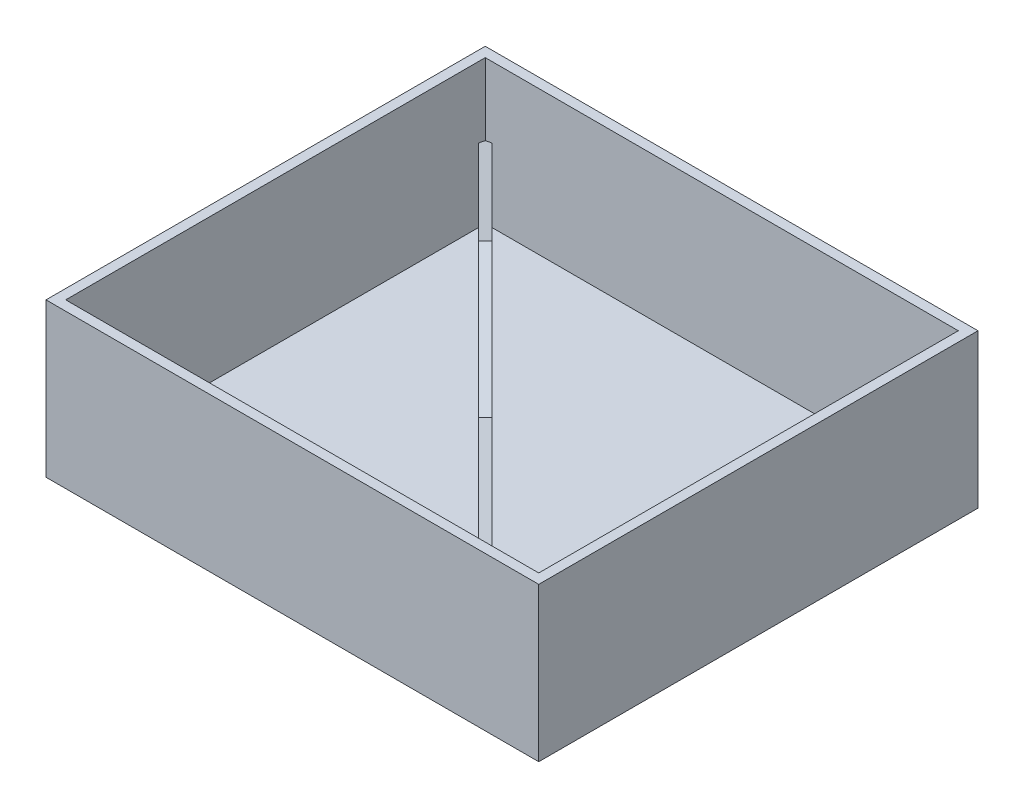
ISO-10303-21;
HEADER;
FILE_DESCRIPTION(('STEP AP214'),'2;1');
FILE_NAME('part.step','',(''),(''),'','','');
FILE_SCHEMA(('AUTOMOTIVE_DESIGN { 1 0 10303 214 1 1 1 1 }'));
ENDSEC;
DATA;
#1=APPLICATION_CONTEXT('core data for automotive mechanical design processes');
#2=APPLICATION_PROTOCOL_DEFINITION('international standard','automotive_design',2000,#1);
#3=PRODUCT_CONTEXT('',#1,'mechanical');
#4=PRODUCT('Part','Part','',(#3));
#5=PRODUCT_RELATED_PRODUCT_CATEGORY('part','',(#4));
#6=PRODUCT_DEFINITION_FORMATION('','',#4);
#7=PRODUCT_DEFINITION_CONTEXT('part definition',#1,'design');
#8=PRODUCT_DEFINITION('design','',#6,#7);
#9=PRODUCT_DEFINITION_SHAPE('','',#8);
#10=(LENGTH_UNIT() NAMED_UNIT(*) SI_UNIT(.MILLI.,.METRE.));
#11=(NAMED_UNIT(*) PLANE_ANGLE_UNIT() SI_UNIT($,.RADIAN.));
#12=(NAMED_UNIT(*) SI_UNIT($,.STERADIAN.) SOLID_ANGLE_UNIT());
#13=UNCERTAINTY_MEASURE_WITH_UNIT(LENGTH_MEASURE(1.E-05),#10,'distance_accuracy_value','');
#14=(GEOMETRIC_REPRESENTATION_CONTEXT(3) GLOBAL_UNCERTAINTY_ASSIGNED_CONTEXT((#13)) GLOBAL_UNIT_ASSIGNED_CONTEXT((#10,
#11,#12)) REPRESENTATION_CONTEXT('',''));
#15=CARTESIAN_POINT('',(0.,0.,0.));
#16=DIRECTION('',(0.,0.,1.));
#17=DIRECTION('',(1.,0.,0.));
#18=AXIS2_PLACEMENT_3D('',#15,#16,#17);
#19=CARTESIAN_POINT('',(0.,2.54,0.));
#20=DIRECTION('',(0.,1.,0.));
#21=DIRECTION('',(0.,0.,1.));
#22=AXIS2_PLACEMENT_3D('',#19,#20,#21);
#23=PLANE('',#22);
#24=DIRECTION('',(-1.,0.,0.));
#25=VECTOR('',#24,1.);
#26=CARTESIAN_POINT('',(-62.4778997860176,2.54,-61.397043942379));
#27=LINE('',#26,#25);
#28=CARTESIAN_POINT('',(62.0602912861796,2.54,-61.397043942379));
#29=VERTEX_POINT('',#28);
#30=CARTESIAN_POINT('',(-58.1418485618038,2.54,-61.397043942379));
#31=VERTEX_POINT('',#30);
#32=EDGE_CURVE('E207',#29,#31,#27,.T.);
#33=ORIENTED_EDGE('',*,*,#32,.T.);
#34=DIRECTION('',(0.707106781186548,0.,0.707106781186547));
#35=VECTOR('',#34,1.);
#36=CARTESIAN_POINT('',(1.62759769028759,2.54,-1.62759769028759));
#37=LINE('',#36,#35);
#38=CARTESIAN_POINT('',(50.0607977593407,2.54,46.8056023787655));
#39=VERTEX_POINT('',#38);
#40=EDGE_CURVE('E244',#31,#39,#37,.T.);
#41=ORIENTED_EDGE('',*,*,#40,.T.);
#42=DIRECTION('',(1.,0.,0.));
#43=VECTOR('',#42,1.);
#44=CARTESIAN_POINT('',(-62.4778997860176,2.54,46.8056023787655));
#45=LINE('',#44,#43);
#46=CARTESIAN_POINT('',(62.0602912861796,2.54,46.8056023787655));
#47=VERTEX_POINT('',#46);
#48=EDGE_CURVE('E186',#39,#47,#45,.T.);
#49=ORIENTED_EDGE('',*,*,#48,.T.);
#50=DIRECTION('',(0.,0.,-1.));
#51=VECTOR('',#50,1.);
#52=CARTESIAN_POINT('',(62.0602912861796,2.54,-63.9370439423789));
#53=LINE('',#52,#51);
#54=EDGE_CURVE('E204',#47,#29,#53,.T.);
#55=ORIENTED_EDGE('',*,*,#54,.T.);
#56=EDGE_LOOP('',(#33,#41,#49,#55));
#57=FACE_BOUND('',#56,.T.);
#58=ADVANCED_FACE('F43',(#57),#23,.T.);
#59=CARTESIAN_POINT('',(-62.4778997860176,39.624,-63.9370439423789));
#60=DIRECTION('',(1.,0.,0.));
#61=DIRECTION('',(0.,0.,-1.));
#62=AXIS2_PLACEMENT_3D('',#59,#60,#61);
#63=PLANE('',#62);
#64=DIRECTION('',(0.,-1.,0.));
#65=VECTOR('',#64,1.);
#66=CARTESIAN_POINT('',(-62.4778997860176,39.624,-63.9370439423789));
#67=LINE('',#66,#65);
#68=CARTESIAN_POINT('',(-62.4778997860176,39.624,-63.9370439423789));
#69=VERTEX_POINT('',#68);
#70=CARTESIAN_POINT('',(-62.4778997860176,0.,-63.9370439423789));
#71=VERTEX_POINT('',#70);
#72=EDGE_CURVE('E227',#69,#71,#67,.T.);
#73=ORIENTED_EDGE('',*,*,#72,.T.);
#74=DIRECTION('',(0.,0.,1.));
#75=VECTOR('',#74,1.);
#76=CARTESIAN_POINT('',(-62.4778997860176,0.,-63.9370439423789));
#77=LINE('',#76,#75);
#78=CARTESIAN_POINT('',(-62.4778997860176,0.,49.3456023787655));
#79=VERTEX_POINT('',#78);
#80=EDGE_CURVE('E194',#71,#79,#77,.T.);
#81=ORIENTED_EDGE('',*,*,#80,.T.);
#82=DIRECTION('',(0.,-1.,0.));
#83=VECTOR('',#82,1.);
#84=CARTESIAN_POINT('',(-62.4778997860176,39.624,49.3456023787655));
#85=LINE('',#84,#83);
#86=CARTESIAN_POINT('',(-62.4778997860176,39.624,49.3456023787655));
#87=VERTEX_POINT('',#86);
#88=EDGE_CURVE('E245',#87,#79,#85,.T.);
#89=ORIENTED_EDGE('',*,*,#88,.F.);
#90=DIRECTION('',(0.,0.,1.));
#91=VECTOR('',#90,1.);
#92=CARTESIAN_POINT('',(-62.4778997860176,39.624,-63.9370439423789));
#93=LINE('',#92,#91);
#94=EDGE_CURVE('E217',#69,#87,#93,.T.);
#95=ORIENTED_EDGE('',*,*,#94,.F.);
#96=EDGE_LOOP('',(#73,#81,#89,#95));
#97=FACE_BOUND('',#96,.T.);
#98=ADVANCED_FACE('F44',(#97),#63,.F.);
#99=CARTESIAN_POINT('',(-62.4778997860176,39.624,49.3456023787655));
#100=DIRECTION('',(0.,0.,-1.));
#101=DIRECTION('',(-1.,0.,0.));
#102=AXIS2_PLACEMENT_3D('',#99,#100,#101);
#103=PLANE('',#102);
#104=DIRECTION('',(1.,0.,0.));
#105=VECTOR('',#104,1.);
#106=CARTESIAN_POINT('',(-62.4778997860176,0.,49.3456023787655));
#107=LINE('',#106,#105);
#108=CARTESIAN_POINT('',(64.6002912861796,0.,49.3456023787655));
#109=VERTEX_POINT('',#108);
#110=EDGE_CURVE('E230',#79,#109,#107,.T.);
#111=ORIENTED_EDGE('',*,*,#110,.T.);
#112=DIRECTION('',(0.,-1.,0.));
#113=VECTOR('',#112,1.);
#114=CARTESIAN_POINT('',(64.6002912861796,39.624,49.3456023787655));
#115=LINE('',#114,#113);
#116=CARTESIAN_POINT('',(64.6002912861796,39.624,49.3456023787655));
#117=VERTEX_POINT('',#116);
#118=EDGE_CURVE('E237',#117,#109,#115,.T.);
#119=ORIENTED_EDGE('',*,*,#118,.F.);
#120=DIRECTION('',(1.,0.,0.));
#121=VECTOR('',#120,1.);
#122=CARTESIAN_POINT('',(-62.4778997860176,39.624,49.3456023787655));
#123=LINE('',#122,#121);
#124=EDGE_CURVE('E220',#87,#117,#123,.T.);
#125=ORIENTED_EDGE('',*,*,#124,.F.);
#126=ORIENTED_EDGE('',*,*,#88,.T.);
#127=EDGE_LOOP('',(#111,#119,#125,#126));
#128=FACE_BOUND('',#127,.T.);
#129=ADVANCED_FACE('F293',(#128),#103,.F.);
#130=CARTESIAN_POINT('',(64.6002912861796,39.624,-63.9370439423789));
#131=DIRECTION('',(-1.,0.,0.));
#132=DIRECTION('',(0.,0.,1.));
#133=AXIS2_PLACEMENT_3D('',#130,#131,#132);
#134=PLANE('',#133);
#135=DIRECTION('',(0.,0.,-1.));
#136=VECTOR('',#135,1.);
#137=CARTESIAN_POINT('',(64.6002912861796,0.,-63.9370439423789));
#138=LINE('',#137,#136);
#139=CARTESIAN_POINT('',(64.6002912861796,0.,-63.9370439423789));
#140=VERTEX_POINT('',#139);
#141=EDGE_CURVE('E233',#109,#140,#138,.T.);
#142=ORIENTED_EDGE('',*,*,#141,.T.);
#143=DIRECTION('',(0.,-1.,0.));
#144=VECTOR('',#143,1.);
#145=CARTESIAN_POINT('',(64.6002912861796,39.624,-63.9370439423789));
#146=LINE('',#145,#144);
#147=CARTESIAN_POINT('',(64.6002912861796,39.624,-63.9370439423789));
#148=VERTEX_POINT('',#147);
#149=EDGE_CURVE('E236',#148,#140,#146,.T.);
#150=ORIENTED_EDGE('',*,*,#149,.F.);
#151=DIRECTION('',(0.,0.,-1.));
#152=VECTOR('',#151,1.);
#153=CARTESIAN_POINT('',(64.6002912861796,39.624,-63.9370439423789));
#154=LINE('',#153,#152);
#155=EDGE_CURVE('E225',#117,#148,#154,.T.);
#156=ORIENTED_EDGE('',*,*,#155,.F.);
#157=ORIENTED_EDGE('',*,*,#118,.T.);
#158=EDGE_LOOP('',(#142,#150,#156,#157));
#159=FACE_BOUND('',#158,.T.);
#160=ADVANCED_FACE('F389',(#159),#134,.F.);
#161=CARTESIAN_POINT('',(-62.4778997860176,39.624,-63.9370439423789));
#162=DIRECTION('',(0.,0.,1.));
#163=DIRECTION('',(1.,0.,0.));
#164=AXIS2_PLACEMENT_3D('',#161,#162,#163);
#165=PLANE('',#164);
#166=DIRECTION('',(-1.,0.,0.));
#167=VECTOR('',#166,1.);
#168=CARTESIAN_POINT('',(-62.4778997860176,0.,-63.9370439423789));
#169=LINE('',#168,#167);
#170=EDGE_CURVE('E222',#140,#71,#169,.T.);
#171=ORIENTED_EDGE('',*,*,#170,.T.);
#172=ORIENTED_EDGE('',*,*,#72,.F.);
#173=DIRECTION('',(-1.,0.,0.));
#174=VECTOR('',#173,1.);
#175=CARTESIAN_POINT('',(-62.4778997860176,39.624,-63.9370439423789));
#176=LINE('',#175,#174);
#177=EDGE_CURVE('E223',#148,#69,#176,.T.);
#178=ORIENTED_EDGE('',*,*,#177,.F.);
#179=ORIENTED_EDGE('',*,*,#149,.T.);
#180=EDGE_LOOP('',(#171,#172,#178,#179));
#181=FACE_BOUND('',#180,.T.);
#182=ADVANCED_FACE('F382',(#181),#165,.F.);
#183=CARTESIAN_POINT('',(0.,39.624,0.));
#184=DIRECTION('',(0.,1.,0.));
#185=DIRECTION('',(0.,0.,1.));
#186=AXIS2_PLACEMENT_3D('',#183,#184,#185);
#187=PLANE('',#186);
#188=DIRECTION('',(0.,0.,1.));
#189=VECTOR('',#188,1.);
#190=CARTESIAN_POINT('',(-59.9378997860176,39.624,-63.9370439423789));
#191=LINE('',#190,#189);
#192=CARTESIAN_POINT('',(-59.9378997860176,39.624,-61.397043942379));
#193=VERTEX_POINT('',#192);
#194=CARTESIAN_POINT('',(-59.9378997860176,39.624,46.8056023787655));
#195=VERTEX_POINT('',#194);
#196=EDGE_CURVE('E208',#193,#195,#191,.T.);
#197=ORIENTED_EDGE('',*,*,#196,.F.);
#198=DIRECTION('',(-1.,0.,0.));
#199=VECTOR('',#198,1.);
#200=CARTESIAN_POINT('',(-62.4778997860176,39.624,-61.397043942379));
#201=LINE('',#200,#199);
#202=CARTESIAN_POINT('',(62.0602912861796,39.624,-61.397043942379));
#203=VERTEX_POINT('',#202);
#204=EDGE_CURVE('E199',#203,#193,#201,.T.);
#205=ORIENTED_EDGE('',*,*,#204,.F.);
#206=DIRECTION('',(0.,0.,-1.));
#207=VECTOR('',#206,1.);
#208=CARTESIAN_POINT('',(62.0602912861796,39.624,-63.9370439423789));
#209=LINE('',#208,#207);
#210=CARTESIAN_POINT('',(62.0602912861796,39.624,46.8056023787655));
#211=VERTEX_POINT('',#210);
#212=EDGE_CURVE('E211',#211,#203,#209,.T.);
#213=ORIENTED_EDGE('',*,*,#212,.F.);
#214=DIRECTION('',(1.,0.,0.));
#215=VECTOR('',#214,1.);
#216=CARTESIAN_POINT('',(-62.4778997860176,39.624,46.8056023787655));
#217=LINE('',#216,#215);
#218=EDGE_CURVE('E215',#195,#211,#217,.T.);
#219=ORIENTED_EDGE('',*,*,#218,.F.);
#220=EDGE_LOOP('',(#197,#205,#213,#219));
#221=FACE_BOUND('',#220,.T.);
#222=ORIENTED_EDGE('',*,*,#94,.T.);
#223=ORIENTED_EDGE('',*,*,#124,.T.);
#224=ORIENTED_EDGE('',*,*,#155,.T.);
#225=ORIENTED_EDGE('',*,*,#177,.T.);
#226=EDGE_LOOP('',(#222,#223,#224,#225));
#227=FACE_BOUND('',#226,.T.);
#228=ADVANCED_FACE('F259',(#221,#227),#187,.T.);
#229=CARTESIAN_POINT('',(0.,0.,0.));
#230=DIRECTION('',(0.,1.,0.));
#231=DIRECTION('',(0.,0.,1.));
#232=AXIS2_PLACEMENT_3D('',#229,#230,#231);
#233=PLANE('',#232);
#234=ORIENTED_EDGE('',*,*,#110,.F.);
#235=ORIENTED_EDGE('',*,*,#80,.F.);
#236=ORIENTED_EDGE('',*,*,#170,.F.);
#237=ORIENTED_EDGE('',*,*,#141,.F.);
#238=EDGE_LOOP('',(#234,#235,#236,#237));
#239=FACE_BOUND('',#238,.T.);
#240=ADVANCED_FACE('F309',(#239),#233,.F.);
#241=CARTESIAN_POINT('',(-59.9378997860176,39.624,-63.9370439423789));
#242=DIRECTION('',(1.,0.,0.));
#243=DIRECTION('',(0.,0.,-1.));
#244=AXIS2_PLACEMENT_3D('',#241,#242,#243);
#245=PLANE('',#244);
#246=DIRECTION('',(0.,-0.189206076258095,-0.981937401623452));
#247=VECTOR('',#246,1.);
#248=CARTESIAN_POINT('',(-59.9378997860176,21.2739437474469,-60.4012359194636));
#249=LINE('',#248,#247);
#250=CARTESIAN_POINT('',(-59.9378997860176,21.0820649897881,-61.397043942379));
#251=VERTEX_POINT('',#250);
#252=CARTESIAN_POINT('',(-59.9378997860176,21.428139805077,-59.6009927181651));
#253=VERTEX_POINT('',#252);
#254=EDGE_CURVE('E152',#251,#253,#249,.F.);
#255=ORIENTED_EDGE('',*,*,#254,.F.);
#256=DIRECTION('',(0.,-1.,0.));
#257=VECTOR('',#256,1.);
#258=CARTESIAN_POINT('',(-59.9378997860176,39.624,-61.397043942379));
#259=LINE('',#258,#257);
#260=EDGE_CURVE('E193',#193,#251,#259,.T.);
#261=ORIENTED_EDGE('',*,*,#260,.F.);
#262=ORIENTED_EDGE('',*,*,#196,.T.);
#263=DIRECTION('',(0.,-1.,0.));
#264=VECTOR('',#263,1.);
#265=CARTESIAN_POINT('',(-59.9378997860176,39.624,46.8056023787655));
#266=LINE('',#265,#264);
#267=CARTESIAN_POINT('',(-59.9378997860176,2.54,46.8056023787655));
#268=VERTEX_POINT('',#267);
#269=EDGE_CURVE('E188',#195,#268,#266,.T.);
#270=ORIENTED_EDGE('',*,*,#269,.T.);
#271=DIRECTION('',(0.,0.,1.));
#272=VECTOR('',#271,1.);
#273=CARTESIAN_POINT('',(-59.9378997860176,2.54,-63.9370439423789));
#274=LINE('',#273,#272);
#275=CARTESIAN_POINT('',(-59.9378997860176,2.54,-59.6009927181651));
#276=VERTEX_POINT('',#275);
#277=EDGE_CURVE('E190',#276,#268,#274,.T.);
#278=ORIENTED_EDGE('',*,*,#277,.F.);
#279=DIRECTION('',(0.,-1.,0.));
#280=VECTOR('',#279,1.);
#281=CARTESIAN_POINT('',(-59.9378997860176,39.624,-59.6009927181651));
#282=LINE('',#281,#280);
#283=EDGE_CURVE('E183',#253,#276,#282,.T.);
#284=ORIENTED_EDGE('',*,*,#283,.F.);
#285=EDGE_LOOP('',(#255,#261,#262,#270,#278,#284));
#286=FACE_BOUND('',#285,.T.);
#287=ADVANCED_FACE('F252',(#286),#245,.T.);
#288=CARTESIAN_POINT('',(-62.4778997860176,39.624,46.8056023787655));
#289=DIRECTION('',(0.,0.,-1.));
#290=DIRECTION('',(-1.,0.,0.));
#291=AXIS2_PLACEMENT_3D('',#288,#289,#290);
#292=PLANE('',#291);
#293=DIRECTION('',(0.,1.,0.));
#294=VECTOR('',#293,1.);
#295=CARTESIAN_POINT('',(46.468695310913,39.624,46.8056023787655));
#296=LINE('',#295,#294);
#297=CARTESIAN_POINT('',(46.468695310913,2.54,46.8056023787655));
#298=VERTEX_POINT('',#297);
#299=CARTESIAN_POINT('',(46.468695310913,33.3613121642154,46.8056023787655));
#300=VERTEX_POINT('',#299);
#301=EDGE_CURVE('E185',#298,#300,#296,.T.);
#302=ORIENTED_EDGE('',*,*,#301,.F.);
#303=EDGE_CURVE('E198',#268,#298,#45,.T.);
#304=ORIENTED_EDGE('',*,*,#303,.F.);
#305=ORIENTED_EDGE('',*,*,#269,.F.);
#306=ORIENTED_EDGE('',*,*,#218,.T.);
#307=DIRECTION('',(0.,-1.,0.));
#308=VECTOR('',#307,1.);
#309=CARTESIAN_POINT('',(62.0602912861796,39.624,46.8056023787655));
#310=LINE('',#309,#308);
#311=EDGE_CURVE('E191',#211,#47,#310,.T.);
#312=ORIENTED_EDGE('',*,*,#311,.T.);
#313=ORIENTED_EDGE('',*,*,#48,.F.);
#314=DIRECTION('',(0.,1.,0.));
#315=VECTOR('',#314,1.);
#316=CARTESIAN_POINT('',(50.0607977593407,39.624,46.8056023787655));
#317=LINE('',#316,#315);
#318=CARTESIAN_POINT('',(50.0607977593407,33.7104679433036,46.8056023787655));
#319=VERTEX_POINT('',#318);
#320=EDGE_CURVE('E59',#39,#319,#317,.T.);
#321=ORIENTED_EDGE('',*,*,#320,.T.);
#322=DIRECTION('',(-0.995309200473239,-0.0967450022136603,0.));
#323=VECTOR('',#322,1.);
#324=CARTESIAN_POINT('',(-60.855162060558,22.9293310129866,46.8056023787655));
#325=LINE('',#324,#323);
#326=EDGE_CURVE('E11',#300,#319,#325,.F.);
#327=ORIENTED_EDGE('',*,*,#326,.F.);
#328=EDGE_LOOP('',(#302,#304,#305,#306,#312,#313,#321,#327));
#329=FACE_BOUND('',#328,.T.);
#330=ADVANCED_FACE('F265',(#329),#292,.T.);
#331=CARTESIAN_POINT('',(62.0602912861796,39.624,-63.9370439423789));
#332=DIRECTION('',(-1.,0.,0.));
#333=DIRECTION('',(0.,0.,1.));
#334=AXIS2_PLACEMENT_3D('',#331,#332,#333);
#335=PLANE('',#334);
#336=ORIENTED_EDGE('',*,*,#54,.F.);
#337=ORIENTED_EDGE('',*,*,#311,.F.);
#338=ORIENTED_EDGE('',*,*,#212,.T.);
#339=DIRECTION('',(0.,-1.,0.));
#340=VECTOR('',#339,1.);
#341=CARTESIAN_POINT('',(62.0602912861796,39.624,-61.397043942379));
#342=LINE('',#341,#340);
#343=EDGE_CURVE('E66',#203,#29,#342,.T.);
#344=ORIENTED_EDGE('',*,*,#343,.T.);
#345=EDGE_LOOP('',(#336,#337,#338,#344));
#346=FACE_BOUND('',#345,.T.);
#347=ADVANCED_FACE('F301',(#346),#335,.T.);
#348=CARTESIAN_POINT('',(-62.4778997860176,39.624,-61.397043942379));
#349=DIRECTION('',(0.,0.,1.));
#350=DIRECTION('',(1.,0.,0.));
#351=AXIS2_PLACEMENT_3D('',#348,#349,#350);
#352=PLANE('',#351);
#353=DIRECTION('',(0.981937401623452,0.189206076258095,0.));
#354=VECTOR('',#353,1.);
#355=CARTESIAN_POINT('',(-58.9420917631022,21.2739437474469,-61.397043942379));
#356=LINE('',#355,#354);
#357=CARTESIAN_POINT('',(-58.1418485618038,21.428139805077,-61.397043942379));
#358=VERTEX_POINT('',#357);
#359=EDGE_CURVE('E51',#358,#251,#356,.F.);
#360=ORIENTED_EDGE('',*,*,#359,.F.);
#361=DIRECTION('',(0.,-1.,0.));
#362=VECTOR('',#361,1.);
#363=CARTESIAN_POINT('',(-58.1418485618038,39.624,-61.397043942379));
#364=LINE('',#363,#362);
#365=EDGE_CURVE('E178',#358,#31,#364,.T.);
#366=ORIENTED_EDGE('',*,*,#365,.T.);
#367=ORIENTED_EDGE('',*,*,#32,.F.);
#368=ORIENTED_EDGE('',*,*,#343,.F.);
#369=ORIENTED_EDGE('',*,*,#204,.T.);
#370=ORIENTED_EDGE('',*,*,#260,.T.);
#371=EDGE_LOOP('',(#360,#366,#367,#368,#369,#370));
#372=FACE_BOUND('',#371,.T.);
#373=ADVANCED_FACE('F251',(#372),#352,.T.);
#374=DIRECTION('',(0.707106781186548,0.,0.707106781186547));
#375=VECTOR('',#374,1.);
#376=CARTESIAN_POINT('',(-0.168453533926241,2.54,0.168453533926241));
#377=LINE('',#376,#375);
#378=EDGE_CURVE('E250',#276,#298,#377,.T.);
#379=ORIENTED_EDGE('',*,*,#378,.F.);
#380=ORIENTED_EDGE('',*,*,#277,.T.);
#381=ORIENTED_EDGE('',*,*,#303,.T.);
#382=EDGE_LOOP('',(#379,#380,#381));
#383=FACE_BOUND('',#382,.T.);
#384=ADVANCED_FACE('F268',(#383),#23,.T.);
#385=CARTESIAN_POINT('',(6.19267906962794,25.357,4.73353491326659));
#386=DIRECTION('',(0.0962954087319371,-0.990683798451503,0.0962954087319371));
#387=DIRECTION('',(0.700519231896705,0.136182273022966,0.700519231896705));
#388=AXIS2_PLACEMENT_3D('',#385,#386,#387);
#389=PLANE('',#388);
#390=DIRECTION('',(0.700519231896705,0.136182273022966,0.700519231896705));
#391=VECTOR('',#390,1.);
#392=CARTESIAN_POINT('',(5.29465345752103,25.357,5.6315605253735));
#393=LINE('',#392,#391);
#394=CARTESIAN_POINT('',(5.29465345752102,25.357,5.63156052537351));
#395=VERTEX_POINT('',#394);
#396=EDGE_CURVE('E166',#395,#300,#393,.T.);
#397=ORIENTED_EDGE('',*,*,#396,.T.);
#398=ORIENTED_EDGE('',*,*,#326,.T.);
#399=DIRECTION('',(0.700519231896705,0.136182273022966,0.700519231896705));
#400=VECTOR('',#399,1.);
#401=CARTESIAN_POINT('',(7.09070468173486,25.357,3.83550930115967));
#402=LINE('',#401,#400);
#403=CARTESIAN_POINT('',(7.09070468173486,25.357,3.83550930115968));
#404=VERTEX_POINT('',#403);
#405=EDGE_CURVE('E174',#404,#319,#402,.T.);
#406=ORIENTED_EDGE('',*,*,#405,.F.);
#407=DIRECTION('',(-0.707106781186547,0.,0.707106781186548));
#408=VECTOR('',#407,1.);
#409=CARTESIAN_POINT('',(6.19267906962794,25.357,4.73353491326659));
#410=LINE('',#409,#408);
#411=EDGE_CURVE('E161',#404,#395,#410,.T.);
#412=ORIENTED_EDGE('',*,*,#411,.T.);
#413=EDGE_LOOP('',(#397,#398,#406,#412));
#414=FACE_BOUND('',#413,.T.);
#415=ADVANCED_FACE('F275',(#414),#389,.F.);
#416=CARTESIAN_POINT('',(-23.4746930418348,35.134,-24.9338371981962));
#417=DIRECTION('',(-0.160477384938449,-0.973906575522844,-0.160477384938449));
#418=DIRECTION('',(0.688655943794372,-0.226949294234123,0.688655943794372));
#419=AXIS2_PLACEMENT_3D('',#416,#417,#418);
#420=PLANE('',#419);
#421=ORIENTED_EDGE('',*,*,#411,.F.);
#422=DIRECTION('',(0.688655943794372,-0.226949294234123,0.688655943794372));
#423=VECTOR('',#422,1.);
#424=CARTESIAN_POINT('',(-22.5766674297279,35.134,-25.8318628103031));
#425=LINE('',#424,#423);
#426=CARTESIAN_POINT('',(-22.5766674297279,35.134,-25.8318628103031));
#427=VERTEX_POINT('',#426);
#428=EDGE_CURVE('E162',#427,#404,#425,.T.);
#429=ORIENTED_EDGE('',*,*,#428,.F.);
#430=DIRECTION('',(-0.707106781186547,0.,0.707106781186548));
#431=VECTOR('',#430,1.);
#432=CARTESIAN_POINT('',(-23.4746930418348,35.134,-24.9338371981962));
#433=LINE('',#432,#431);
#434=CARTESIAN_POINT('',(-24.3727186539418,35.134,-24.0358115860893));
#435=VERTEX_POINT('',#434);
#436=EDGE_CURVE('E146',#427,#435,#433,.T.);
#437=ORIENTED_EDGE('',*,*,#436,.T.);
#438=DIRECTION('',(0.688655943794372,-0.226949294234123,0.688655943794372));
#439=VECTOR('',#438,1.);
#440=CARTESIAN_POINT('',(-24.3727186539418,35.134,-24.0358115860893));
#441=LINE('',#440,#439);
#442=EDGE_CURVE('E157',#435,#395,#441,.T.);
#443=ORIENTED_EDGE('',*,*,#442,.T.);
#444=EDGE_LOOP('',(#421,#429,#437,#443));
#445=FACE_BOUND('',#444,.T.);
#446=ADVANCED_FACE('F158',(#445),#420,.F.);
#447=CARTESIAN_POINT('',(-59.9380684272816,21.082,-61.3972125836429));
#448=DIRECTION('',(0.185907687388523,-0.96481949790606,0.185907687388523));
#449=DIRECTION('',(0.682230409590376,0.262913172854267,0.682230409590375));
#450=AXIS2_PLACEMENT_3D('',#447,#448,#449);
#451=PLANE('',#450);
#452=ORIENTED_EDGE('',*,*,#359,.T.);
#453=ORIENTED_EDGE('',*,*,#254,.T.);
#454=DIRECTION('',(0.682230409590376,0.262913172854267,0.682230409590375));
#455=VECTOR('',#454,1.);
#456=CARTESIAN_POINT('',(-60.8360940393885,21.082,-60.499186971536));
#457=LINE('',#456,#455);
#458=EDGE_CURVE('E143',#253,#435,#457,.T.);
#459=ORIENTED_EDGE('',*,*,#458,.T.);
#460=ORIENTED_EDGE('',*,*,#436,.F.);
#461=DIRECTION('',(0.682230409590376,0.262913172854267,0.682230409590375));
#462=VECTOR('',#461,1.);
#463=CARTESIAN_POINT('',(-59.0400428151746,21.082,-62.2952381957498));
#464=LINE('',#463,#462);
#465=EDGE_CURVE('E167',#358,#427,#464,.T.);
#466=ORIENTED_EDGE('',*,*,#465,.F.);
#467=EDGE_LOOP('',(#452,#453,#459,#460,#466));
#468=FACE_BOUND('',#467,.T.);
#469=ADVANCED_FACE('F150',(#468),#451,.F.);
#470=CARTESIAN_POINT('',(6.24983687337545,28.0443994247742,6.58674394122793));
#471=DIRECTION('',(-0.707106781186547,0.,0.707106781186548));
#472=DIRECTION('',(0.707106781186548,0.,0.707106781186547));
#473=AXIS2_PLACEMENT_3D('',#470,#471,#472);
#474=PLANE('',#473);
#475=ORIENTED_EDGE('',*,*,#458,.F.);
#476=ORIENTED_EDGE('',*,*,#283,.T.);
#477=ORIENTED_EDGE('',*,*,#378,.T.);
#478=ORIENTED_EDGE('',*,*,#301,.T.);
#479=ORIENTED_EDGE('',*,*,#396,.F.);
#480=ORIENTED_EDGE('',*,*,#442,.F.);
#481=EDGE_LOOP('',(#475,#476,#477,#478,#479,#480));
#482=FACE_BOUND('',#481,.T.);
#483=ADVANCED_FACE('F168',(#482),#474,.T.);
#484=CARTESIAN_POINT('',(8.04588809758928,28.0443994247742,4.7906927170141));
#485=DIRECTION('',(-0.707106781186547,0.,0.707106781186548));
#486=DIRECTION('',(0.707106781186548,0.,0.707106781186547));
#487=AXIS2_PLACEMENT_3D('',#484,#485,#486);
#488=PLANE('',#487);
#489=ORIENTED_EDGE('',*,*,#320,.F.);
#490=ORIENTED_EDGE('',*,*,#40,.F.);
#491=ORIENTED_EDGE('',*,*,#365,.F.);
#492=ORIENTED_EDGE('',*,*,#465,.T.);
#493=ORIENTED_EDGE('',*,*,#428,.T.);
#494=ORIENTED_EDGE('',*,*,#405,.T.);
#495=EDGE_LOOP('',(#489,#490,#491,#492,#493,#494));
#496=FACE_BOUND('',#495,.T.);
#497=ADVANCED_FACE('F280',(#496),#488,.F.);
#498=CLOSED_SHELL('',(#58,#98,#129,#160,#182,#228,#240,#287,#330,#347,#373,#384,#415,#446,#469,
#483,#497));
#499=MANIFOLD_SOLID_BREP('B2',#498);
#500=ADVANCED_BREP_SHAPE_REPRESENTATION('',(#18,#499),#14);
#501=SHAPE_DEFINITION_REPRESENTATION(#9,#500);
ENDSEC;
END-ISO-10303-21;
